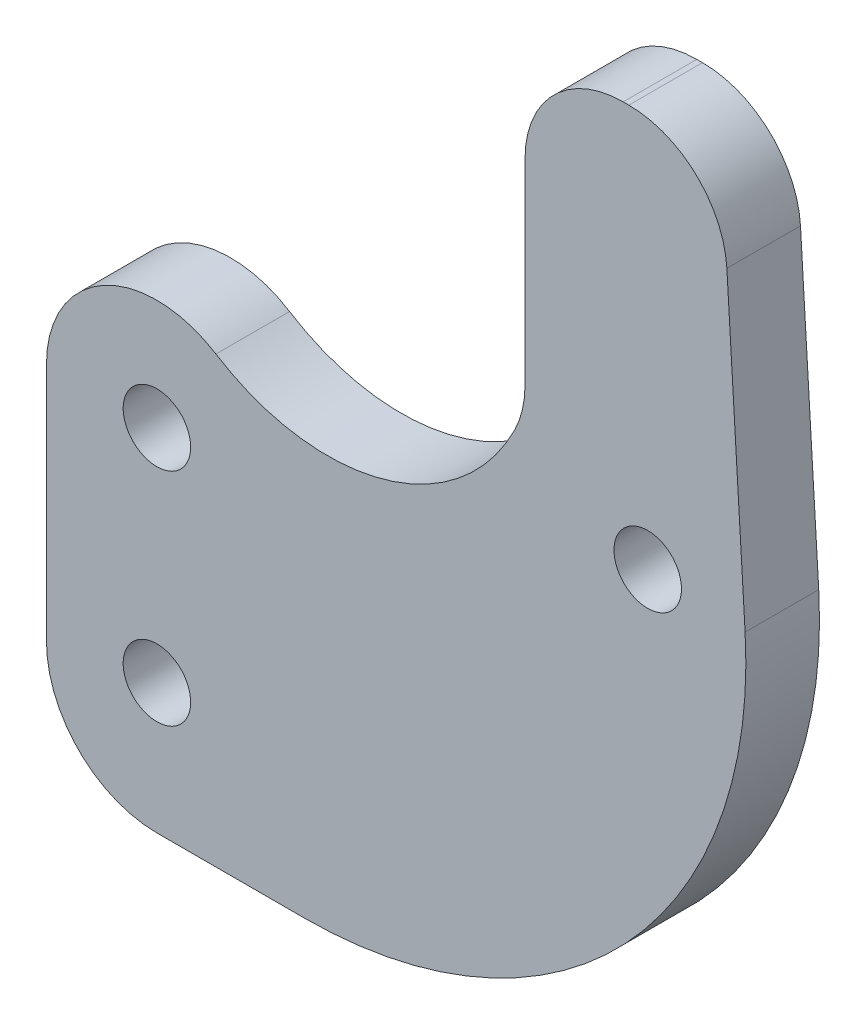
ISO-10303-21;
HEADER;
FILE_DESCRIPTION(('STEP AP214'),'2;1');
FILE_NAME('part.step','',(''),(''),'','','');
FILE_SCHEMA(('AUTOMOTIVE_DESIGN { 1 0 10303 214 1 1 1 1 }'));
ENDSEC;
DATA;
#1=APPLICATION_CONTEXT('core data for automotive mechanical design processes');
#2=APPLICATION_PROTOCOL_DEFINITION('international standard','automotive_design',2000,#1);
#3=PRODUCT_CONTEXT('',#1,'mechanical');
#4=PRODUCT('Part','Part','',(#3));
#5=PRODUCT_RELATED_PRODUCT_CATEGORY('part','',(#4));
#6=PRODUCT_DEFINITION_FORMATION('','',#4);
#7=PRODUCT_DEFINITION_CONTEXT('part definition',#1,'design');
#8=PRODUCT_DEFINITION('design','',#6,#7);
#9=PRODUCT_DEFINITION_SHAPE('','',#8);
#10=(LENGTH_UNIT() NAMED_UNIT(*) SI_UNIT(.MILLI.,.METRE.));
#11=(NAMED_UNIT(*) PLANE_ANGLE_UNIT() SI_UNIT($,.RADIAN.));
#12=(NAMED_UNIT(*) SI_UNIT($,.STERADIAN.) SOLID_ANGLE_UNIT());
#13=UNCERTAINTY_MEASURE_WITH_UNIT(LENGTH_MEASURE(1.E-05),#10,'distance_accuracy_value','');
#14=(GEOMETRIC_REPRESENTATION_CONTEXT(3) GLOBAL_UNCERTAINTY_ASSIGNED_CONTEXT((#13)) GLOBAL_UNIT_ASSIGNED_CONTEXT((#10,
#11,#12)) REPRESENTATION_CONTEXT('',''));
#15=CARTESIAN_POINT('',(0.,0.,0.));
#16=DIRECTION('',(0.,0.,1.));
#17=DIRECTION('',(1.,0.,0.));
#18=AXIS2_PLACEMENT_3D('',#15,#16,#17);
#19=CARTESIAN_POINT('',(0.,-0.8,3.));
#20=DIRECTION('',(0.,0.,1.));
#21=DIRECTION('',(1.,0.,0.));
#22=AXIS2_PLACEMENT_3D('',#19,#20,#21);
#23=PLANE('',#22);
#24=CARTESIAN_POINT('',(0.,9.,3.));
#25=DIRECTION('',(0.,0.,1.));
#26=DIRECTION('',(1.,0.,0.));
#27=AXIS2_PLACEMENT_3D('',#24,#25,#26);
#28=CIRCLE('',#27,1.375);
#29=CARTESIAN_POINT('',(1.375,9.,3.));
#30=VERTEX_POINT('',#29);
#31=EDGE_CURVE('E284',#30,#30,#28,.T.);
#32=ORIENTED_EDGE('',*,*,#31,.F.);
#33=EDGE_LOOP('',(#32));
#34=FACE_BOUND('',#33,.T.);
#35=DIRECTION('',(-1.,0.,0.));
#36=VECTOR('',#35,1.);
#37=CARTESIAN_POINT('',(15.,30.,3.));
#38=LINE('',#37,#36);
#39=CARTESIAN_POINT('',(19.2315015872004,30.,3.));
#40=VERTEX_POINT('',#39);
#41=CARTESIAN_POINT('',(19.,30.,3.));
#42=VERTEX_POINT('',#41);
#43=EDGE_CURVE('E188',#40,#42,#38,.T.);
#44=ORIENTED_EDGE('',*,*,#43,.T.);
#45=CARTESIAN_POINT('',(19.,26.,3.));
#46=DIRECTION('',(0.,0.,1.));
#47=DIRECTION('',(1.,0.,0.));
#48=AXIS2_PLACEMENT_3D('',#45,#46,#47);
#49=CIRCLE('',#48,4.);
#50=CARTESIAN_POINT('',(15.,26.,3.));
#51=VERTEX_POINT('',#50);
#52=EDGE_CURVE('E45',#42,#51,#49,.T.);
#53=ORIENTED_EDGE('',*,*,#52,.T.);
#54=DIRECTION('',(0.,-1.,0.));
#55=VECTOR('',#54,1.);
#56=CARTESIAN_POINT('',(15.,18.,3.));
#57=LINE('',#56,#55);
#58=CARTESIAN_POINT('',(15.,18.,3.));
#59=VERTEX_POINT('',#58);
#60=EDGE_CURVE('E186',#51,#59,#57,.T.);
#61=ORIENTED_EDGE('',*,*,#60,.T.);
#62=CARTESIAN_POINT('',(11.,18.,3.));
#63=DIRECTION('',(0.,0.,-1.));
#64=DIRECTION('',(-1.,0.,0.));
#65=AXIS2_PLACEMENT_3D('',#62,#63,#64);
#66=CIRCLE('',#65,4.);
#67=CARTESIAN_POINT('',(14.585878733306,16.2275797027725,3.));
#68=VERTEX_POINT('',#67);
#69=EDGE_CURVE('E197',#59,#68,#66,.T.);
#70=ORIENTED_EDGE('',*,*,#69,.T.);
#71=CARTESIAN_POINT('',(6.95369254243466,20.,3.));
#72=DIRECTION('',(0.,0.,-1.));
#73=DIRECTION('',(1.,0.,0.));
#74=AXIS2_PLACEMENT_3D('',#71,#72,#73);
#75=CIRCLE('',#74,8.51360211373897);
#76=CARTESIAN_POINT('',(2.40453151767413,12.8037124208478,3.));
#77=VERTEX_POINT('',#76);
#78=EDGE_CURVE('E264',#68,#77,#75,.T.);
#79=ORIENTED_EDGE('',*,*,#78,.T.);
#80=CARTESIAN_POINT('',(0.,9.,3.));
#81=DIRECTION('',(0.,0.,1.));
#82=DIRECTION('',(1.,0.,0.));
#83=AXIS2_PLACEMENT_3D('',#80,#81,#82);
#84=CIRCLE('',#83,4.5);
#85=CARTESIAN_POINT('',(-4.5,9.,3.));
#86=VERTEX_POINT('',#85);
#87=EDGE_CURVE('E267',#77,#86,#84,.T.);
#88=ORIENTED_EDGE('',*,*,#87,.T.);
#89=DIRECTION('',(0.,-1.,0.));
#90=VECTOR('',#89,1.);
#91=CARTESIAN_POINT('',(-4.5,-0.8,3.));
#92=LINE('',#91,#90);
#93=CARTESIAN_POINT('',(-4.5,-0.8,3.));
#94=VERTEX_POINT('',#93);
#95=EDGE_CURVE('E145',#86,#94,#92,.T.);
#96=ORIENTED_EDGE('',*,*,#95,.T.);
#97=CARTESIAN_POINT('',(0.,-0.8,3.));
#98=DIRECTION('',(0.,0.,1.));
#99=DIRECTION('',(1.,0.,0.));
#100=AXIS2_PLACEMENT_3D('',#97,#98,#99);
#101=CIRCLE('',#100,4.5);
#102=CARTESIAN_POINT('',(0.,-5.3,3.));
#103=VERTEX_POINT('',#102);
#104=EDGE_CURVE('E140',#94,#103,#101,.T.);
#105=ORIENTED_EDGE('',*,*,#104,.T.);
#106=DIRECTION('',(1.,0.,0.));
#107=VECTOR('',#106,1.);
#108=CARTESIAN_POINT('',(0.,-5.3,3.));
#109=LINE('',#108,#107);
#110=CARTESIAN_POINT('',(6.,-5.3,3.));
#111=VERTEX_POINT('',#110);
#112=EDGE_CURVE('E128',#103,#111,#109,.T.);
#113=ORIENTED_EDGE('',*,*,#112,.T.);
#114=CARTESIAN_POINT('',(6.,12.7,3.));
#115=DIRECTION('',(0.,0.,1.));
#116=DIRECTION('',(1.,0.,0.));
#117=AXIS2_PLACEMENT_3D('',#114,#115,#116);
#118=CIRCLE('',#117,18.);
#119=CARTESIAN_POINT('',(23.96805883273,13.7718497019416,3.));
#120=VERTEX_POINT('',#119);
#121=EDGE_CURVE('E139',#111,#120,#118,.T.);
#122=ORIENTED_EDGE('',*,*,#121,.T.);
#123=DIRECTION('',(-0.0595472056634214,0.998225490707224,0.));
#124=VECTOR('',#123,1.);
#125=CARTESIAN_POINT('',(23.96805883273,13.7718497019416,3.));
#126=LINE('',#125,#124);
#127=CARTESIAN_POINT('',(23.2244035500293,26.2381888226537,3.));
#128=VERTEX_POINT('',#127);
#129=EDGE_CURVE('E250',#120,#128,#126,.T.);
#130=ORIENTED_EDGE('',*,*,#129,.T.);
#131=CARTESIAN_POINT('',(19.2315015872004,26.,3.));
#132=DIRECTION('',(0.,0.,1.));
#133=DIRECTION('',(1.,0.,0.));
#134=AXIS2_PLACEMENT_3D('',#131,#132,#133);
#135=CIRCLE('',#134,4.);
#136=EDGE_CURVE('E180',#128,#40,#135,.T.);
#137=ORIENTED_EDGE('',*,*,#136,.T.);
#138=EDGE_LOOP('',(#44,#53,#61,#70,#79,#88,#96,#105,#113,#122,#130,#137));
#139=FACE_BOUND('',#138,.T.);
#140=CARTESIAN_POINT('',(0.,0.,3.));
#141=DIRECTION('',(0.,0.,1.));
#142=DIRECTION('',(1.,0.,0.));
#143=AXIS2_PLACEMENT_3D('',#140,#141,#142);
#144=CIRCLE('',#143,1.375);
#145=CARTESIAN_POINT('',(1.375,0.,3.));
#146=VERTEX_POINT('',#145);
#147=EDGE_CURVE('E275',#146,#146,#144,.T.);
#148=ORIENTED_EDGE('',*,*,#147,.F.);
#149=EDGE_LOOP('',(#148));
#150=FACE_BOUND('',#149,.T.);
#151=CARTESIAN_POINT('',(20.,14.,3.));
#152=DIRECTION('',(0.,0.,1.));
#153=DIRECTION('',(1.,0.,0.));
#154=AXIS2_PLACEMENT_3D('',#151,#152,#153);
#155=CIRCLE('',#154,1.375);
#156=CARTESIAN_POINT('',(21.375,14.,3.));
#157=VERTEX_POINT('',#156);
#158=EDGE_CURVE('E292',#157,#157,#155,.T.);
#159=ORIENTED_EDGE('',*,*,#158,.F.);
#160=EDGE_LOOP('',(#159));
#161=FACE_BOUND('',#160,.T.);
#162=ADVANCED_FACE('F36',(#34,#139,#150,#161),#23,.T.);
#163=CARTESIAN_POINT('',(0.,-0.8,0.));
#164=DIRECTION('',(0.,0.,1.));
#165=DIRECTION('',(1.,0.,0.));
#166=AXIS2_PLACEMENT_3D('',#163,#164,#165);
#167=PLANE('',#166);
#168=DIRECTION('',(0.,-1.,0.));
#169=VECTOR('',#168,1.);
#170=CARTESIAN_POINT('',(15.,18.,0.));
#171=LINE('',#170,#169);
#172=CARTESIAN_POINT('',(15.,26.,0.));
#173=VERTEX_POINT('',#172);
#174=CARTESIAN_POINT('',(15.,18.,0.));
#175=VERTEX_POINT('',#174);
#176=EDGE_CURVE('E206',#173,#175,#171,.T.);
#177=ORIENTED_EDGE('',*,*,#176,.F.);
#178=CARTESIAN_POINT('',(19.,26.,0.));
#179=DIRECTION('',(0.,0.,1.));
#180=DIRECTION('',(1.,0.,0.));
#181=AXIS2_PLACEMENT_3D('',#178,#179,#180);
#182=CIRCLE('',#181,4.);
#183=CARTESIAN_POINT('',(19.,30.,0.));
#184=VERTEX_POINT('',#183);
#185=EDGE_CURVE('E171',#173,#184,#182,.F.);
#186=ORIENTED_EDGE('',*,*,#185,.T.);
#187=DIRECTION('',(-1.,0.,0.));
#188=VECTOR('',#187,1.);
#189=CARTESIAN_POINT('',(15.,30.,0.));
#190=LINE('',#189,#188);
#191=CARTESIAN_POINT('',(19.2315015872004,30.,0.));
#192=VERTEX_POINT('',#191);
#193=EDGE_CURVE('E204',#192,#184,#190,.T.);
#194=ORIENTED_EDGE('',*,*,#193,.F.);
#195=CARTESIAN_POINT('',(19.2315015872004,26.,0.));
#196=DIRECTION('',(0.,0.,1.));
#197=DIRECTION('',(1.,0.,0.));
#198=AXIS2_PLACEMENT_3D('',#195,#196,#197);
#199=CIRCLE('',#198,4.);
#200=CARTESIAN_POINT('',(23.2244035500293,26.2381888226537,0.));
#201=VERTEX_POINT('',#200);
#202=EDGE_CURVE('E162',#192,#201,#199,.F.);
#203=ORIENTED_EDGE('',*,*,#202,.T.);
#204=DIRECTION('',(-0.0595472056634214,0.998225490707224,0.));
#205=VECTOR('',#204,1.);
#206=CARTESIAN_POINT('',(23.96805883273,13.7718497019416,0.));
#207=LINE('',#206,#205);
#208=CARTESIAN_POINT('',(23.96805883273,13.7718497019416,0.));
#209=VERTEX_POINT('',#208);
#210=EDGE_CURVE('E210',#209,#201,#207,.T.);
#211=ORIENTED_EDGE('',*,*,#210,.F.);
#212=CARTESIAN_POINT('',(6.,12.7,0.));
#213=DIRECTION('',(0.,0.,1.));
#214=DIRECTION('',(1.,0.,0.));
#215=AXIS2_PLACEMENT_3D('',#212,#213,#214);
#216=CIRCLE('',#215,18.);
#217=CARTESIAN_POINT('',(6.,-5.3,0.));
#218=VERTEX_POINT('',#217);
#219=EDGE_CURVE('E216',#218,#209,#216,.T.);
#220=ORIENTED_EDGE('',*,*,#219,.F.);
#221=DIRECTION('',(1.,0.,0.));
#222=VECTOR('',#221,1.);
#223=CARTESIAN_POINT('',(0.,-5.3,0.));
#224=LINE('',#223,#222);
#225=CARTESIAN_POINT('',(0.,-5.3,0.));
#226=VERTEX_POINT('',#225);
#227=EDGE_CURVE('E274',#226,#218,#224,.T.);
#228=ORIENTED_EDGE('',*,*,#227,.F.);
#229=CARTESIAN_POINT('',(0.,-0.8,0.));
#230=DIRECTION('',(0.,0.,1.));
#231=DIRECTION('',(1.,0.,0.));
#232=AXIS2_PLACEMENT_3D('',#229,#230,#231);
#233=CIRCLE('',#232,4.5);
#234=CARTESIAN_POINT('',(-4.5,-0.8,0.));
#235=VERTEX_POINT('',#234);
#236=EDGE_CURVE('E154',#235,#226,#233,.T.);
#237=ORIENTED_EDGE('',*,*,#236,.F.);
#238=DIRECTION('',(0.,-1.,0.));
#239=VECTOR('',#238,1.);
#240=CARTESIAN_POINT('',(-4.5,-0.8,0.));
#241=LINE('',#240,#239);
#242=CARTESIAN_POINT('',(-4.5,9.,0.));
#243=VERTEX_POINT('',#242);
#244=EDGE_CURVE('E150',#243,#235,#241,.T.);
#245=ORIENTED_EDGE('',*,*,#244,.F.);
#246=CARTESIAN_POINT('',(0.,9.,0.));
#247=DIRECTION('',(0.,0.,1.));
#248=DIRECTION('',(1.,0.,0.));
#249=AXIS2_PLACEMENT_3D('',#246,#247,#248);
#250=CIRCLE('',#249,4.5);
#251=CARTESIAN_POINT('',(2.40453151767413,12.8037124208478,0.));
#252=VERTEX_POINT('',#251);
#253=EDGE_CURVE('E225',#252,#243,#250,.T.);
#254=ORIENTED_EDGE('',*,*,#253,.F.);
#255=CARTESIAN_POINT('',(6.95369254243466,20.,0.));
#256=DIRECTION('',(0.,0.,-1.));
#257=DIRECTION('',(1.,0.,0.));
#258=AXIS2_PLACEMENT_3D('',#255,#256,#257);
#259=CIRCLE('',#258,8.51360211373897);
#260=CARTESIAN_POINT('',(14.585878733306,16.2275797027725,0.));
#261=VERTEX_POINT('',#260);
#262=EDGE_CURVE('E222',#261,#252,#259,.T.);
#263=ORIENTED_EDGE('',*,*,#262,.F.);
#264=CARTESIAN_POINT('',(11.,18.,0.));
#265=DIRECTION('',(0.,0.,-1.));
#266=DIRECTION('',(-1.,0.,0.));
#267=AXIS2_PLACEMENT_3D('',#264,#265,#266);
#268=CIRCLE('',#267,4.);
#269=EDGE_CURVE('E213',#175,#261,#268,.T.);
#270=ORIENTED_EDGE('',*,*,#269,.F.);
#271=EDGE_LOOP('',(#177,#186,#194,#203,#211,#220,#228,#237,#245,#254,#263,#270));
#272=FACE_BOUND('',#271,.T.);
#273=CARTESIAN_POINT('',(0.,0.,0.));
#274=DIRECTION('',(0.,0.,1.));
#275=DIRECTION('',(1.,0.,0.));
#276=AXIS2_PLACEMENT_3D('',#273,#274,#275);
#277=CIRCLE('',#276,1.375);
#278=CARTESIAN_POINT('',(1.375,0.,0.));
#279=VERTEX_POINT('',#278);
#280=EDGE_CURVE('E281',#279,#279,#277,.T.);
#281=ORIENTED_EDGE('',*,*,#280,.T.);
#282=EDGE_LOOP('',(#281));
#283=FACE_BOUND('',#282,.T.);
#284=CARTESIAN_POINT('',(0.,9.,0.));
#285=DIRECTION('',(0.,0.,1.));
#286=DIRECTION('',(1.,0.,0.));
#287=AXIS2_PLACEMENT_3D('',#284,#285,#286);
#288=CIRCLE('',#287,1.375);
#289=CARTESIAN_POINT('',(1.375,9.,0.));
#290=VERTEX_POINT('',#289);
#291=EDGE_CURVE('E288',#290,#290,#288,.T.);
#292=ORIENTED_EDGE('',*,*,#291,.T.);
#293=EDGE_LOOP('',(#292));
#294=FACE_BOUND('',#293,.T.);
#295=CARTESIAN_POINT('',(20.,14.,0.));
#296=DIRECTION('',(0.,0.,1.));
#297=DIRECTION('',(1.,0.,0.));
#298=AXIS2_PLACEMENT_3D('',#295,#296,#297);
#299=CIRCLE('',#298,1.375);
#300=CARTESIAN_POINT('',(21.375,14.,0.));
#301=VERTEX_POINT('',#300);
#302=EDGE_CURVE('E296',#301,#301,#299,.T.);
#303=ORIENTED_EDGE('',*,*,#302,.T.);
#304=EDGE_LOOP('',(#303));
#305=FACE_BOUND('',#304,.T.);
#306=ADVANCED_FACE('F202',(#272,#283,#294,#305),#167,.F.);
#307=CARTESIAN_POINT('',(0.,-0.8,3.));
#308=DIRECTION('',(0.,0.,-1.));
#309=DIRECTION('',(-1.,0.,0.));
#310=AXIS2_PLACEMENT_3D('',#307,#308,#309);
#311=CYLINDRICAL_SURFACE('',#310,4.5);
#312=ORIENTED_EDGE('',*,*,#236,.T.);
#313=DIRECTION('',(0.,0.,-1.));
#314=VECTOR('',#313,1.);
#315=CARTESIAN_POINT('',(0.,-5.3,3.));
#316=LINE('',#315,#314);
#317=EDGE_CURVE('E132',#103,#226,#316,.T.);
#318=ORIENTED_EDGE('',*,*,#317,.F.);
#319=ORIENTED_EDGE('',*,*,#104,.F.);
#320=DIRECTION('',(0.,0.,-1.));
#321=VECTOR('',#320,1.);
#322=CARTESIAN_POINT('',(-4.5,-0.8,3.));
#323=LINE('',#322,#321);
#324=EDGE_CURVE('E230',#94,#235,#323,.T.);
#325=ORIENTED_EDGE('',*,*,#324,.T.);
#326=EDGE_LOOP('',(#312,#318,#319,#325));
#327=FACE_BOUND('',#326,.T.);
#328=ADVANCED_FACE('F152',(#327),#311,.T.);
#329=CARTESIAN_POINT('',(0.,-5.3,3.));
#330=DIRECTION('',(0.,1.,0.));
#331=DIRECTION('',(-1.,0.,0.));
#332=AXIS2_PLACEMENT_3D('',#329,#330,#331);
#333=PLANE('',#332);
#334=ORIENTED_EDGE('',*,*,#227,.T.);
#335=DIRECTION('',(0.,0.,-1.));
#336=VECTOR('',#335,1.);
#337=CARTESIAN_POINT('',(6.,-5.3,3.));
#338=LINE('',#337,#336);
#339=EDGE_CURVE('E135',#111,#218,#338,.T.);
#340=ORIENTED_EDGE('',*,*,#339,.F.);
#341=ORIENTED_EDGE('',*,*,#112,.F.);
#342=ORIENTED_EDGE('',*,*,#317,.T.);
#343=EDGE_LOOP('',(#334,#340,#341,#342));
#344=FACE_BOUND('',#343,.T.);
#345=ADVANCED_FACE('F130',(#344),#333,.F.);
#346=CARTESIAN_POINT('',(6.,12.7,3.));
#347=DIRECTION('',(0.,0.,-1.));
#348=DIRECTION('',(-1.,0.,0.));
#349=AXIS2_PLACEMENT_3D('',#346,#347,#348);
#350=CYLINDRICAL_SURFACE('',#349,18.);
#351=ORIENTED_EDGE('',*,*,#219,.T.);
#352=DIRECTION('',(0.,0.,-1.));
#353=VECTOR('',#352,1.);
#354=CARTESIAN_POINT('',(23.96805883273,13.7718497019416,3.));
#355=LINE('',#354,#353);
#356=EDGE_CURVE('E165',#120,#209,#355,.T.);
#357=ORIENTED_EDGE('',*,*,#356,.F.);
#358=ORIENTED_EDGE('',*,*,#121,.F.);
#359=ORIENTED_EDGE('',*,*,#339,.T.);
#360=EDGE_LOOP('',(#351,#357,#358,#359));
#361=FACE_BOUND('',#360,.T.);
#362=ADVANCED_FACE('F278',(#361),#350,.T.);
#363=CARTESIAN_POINT('',(23.96805883273,13.7718497019416,3.));
#364=DIRECTION('',(-0.998225490707224,-0.0595472056634214,0.));
#365=DIRECTION('',(0.0595472056634214,-0.998225490707224,0.));
#366=AXIS2_PLACEMENT_3D('',#363,#364,#365);
#367=PLANE('',#366);
#368=ORIENTED_EDGE('',*,*,#210,.T.);
#369=DIRECTION('',(0.,0.,-1.));
#370=VECTOR('',#369,1.);
#371=CARTESIAN_POINT('',(23.2244035500293,26.2381888226537,3.));
#372=LINE('',#371,#370);
#373=EDGE_CURVE('E11',#201,#128,#372,.F.);
#374=ORIENTED_EDGE('',*,*,#373,.T.);
#375=ORIENTED_EDGE('',*,*,#129,.F.);
#376=ORIENTED_EDGE('',*,*,#356,.T.);
#377=EDGE_LOOP('',(#368,#374,#375,#376));
#378=FACE_BOUND('',#377,.T.);
#379=ADVANCED_FACE('F249',(#378),#367,.F.);
#380=CARTESIAN_POINT('',(15.,30.,3.));
#381=DIRECTION('',(0.,-1.,0.));
#382=DIRECTION('',(0.,0.,-1.));
#383=AXIS2_PLACEMENT_3D('',#380,#381,#382);
#384=PLANE('',#383);
#385=ORIENTED_EDGE('',*,*,#193,.T.);
#386=DIRECTION('',(0.,0.,-1.));
#387=VECTOR('',#386,1.);
#388=CARTESIAN_POINT('',(19.,30.,3.));
#389=LINE('',#388,#387);
#390=EDGE_CURVE('E58',#184,#42,#389,.F.);
#391=ORIENTED_EDGE('',*,*,#390,.T.);
#392=ORIENTED_EDGE('',*,*,#43,.F.);
#393=DIRECTION('',(0.,0.,-1.));
#394=VECTOR('',#393,1.);
#395=CARTESIAN_POINT('',(19.2315015872004,30.,3.));
#396=LINE('',#395,#394);
#397=EDGE_CURVE('E174',#40,#192,#396,.T.);
#398=ORIENTED_EDGE('',*,*,#397,.T.);
#399=EDGE_LOOP('',(#385,#391,#392,#398));
#400=FACE_BOUND('',#399,.T.);
#401=ADVANCED_FACE('F207',(#400),#384,.F.);
#402=CARTESIAN_POINT('',(15.,18.,3.));
#403=DIRECTION('',(1.,0.,0.));
#404=DIRECTION('',(0.,0.,-1.));
#405=AXIS2_PLACEMENT_3D('',#402,#403,#404);
#406=PLANE('',#405);
#407=ORIENTED_EDGE('',*,*,#60,.F.);
#408=DIRECTION('',(0.,0.,-1.));
#409=VECTOR('',#408,1.);
#410=CARTESIAN_POINT('',(15.,26.,3.));
#411=LINE('',#410,#409);
#412=EDGE_CURVE('E156',#51,#173,#411,.T.);
#413=ORIENTED_EDGE('',*,*,#412,.T.);
#414=ORIENTED_EDGE('',*,*,#176,.T.);
#415=DIRECTION('',(0.,0.,-1.));
#416=VECTOR('',#415,1.);
#417=CARTESIAN_POINT('',(15.,18.,3.));
#418=LINE('',#417,#416);
#419=EDGE_CURVE('E195',#59,#175,#418,.T.);
#420=ORIENTED_EDGE('',*,*,#419,.F.);
#421=EDGE_LOOP('',(#407,#413,#414,#420));
#422=FACE_BOUND('',#421,.T.);
#423=ADVANCED_FACE('F192',(#422),#406,.F.);
#424=CARTESIAN_POINT('',(11.,18.,3.));
#425=DIRECTION('',(0.,0.,-1.));
#426=DIRECTION('',(-1.,0.,0.));
#427=AXIS2_PLACEMENT_3D('',#424,#425,#426);
#428=CYLINDRICAL_SURFACE('',#427,4.);
#429=ORIENTED_EDGE('',*,*,#269,.T.);
#430=DIRECTION('',(0.,0.,-1.));
#431=VECTOR('',#430,1.);
#432=CARTESIAN_POINT('',(14.585878733306,16.2275797027725,3.));
#433=LINE('',#432,#431);
#434=EDGE_CURVE('E240',#68,#261,#433,.T.);
#435=ORIENTED_EDGE('',*,*,#434,.F.);
#436=ORIENTED_EDGE('',*,*,#69,.F.);
#437=ORIENTED_EDGE('',*,*,#419,.T.);
#438=EDGE_LOOP('',(#429,#435,#436,#437));
#439=FACE_BOUND('',#438,.T.);
#440=ADVANCED_FACE('F329',(#439),#428,.F.);
#441=CARTESIAN_POINT('',(6.95369254243466,20.,3.));
#442=DIRECTION('',(0.,0.,-1.));
#443=DIRECTION('',(-1.,0.,0.));
#444=AXIS2_PLACEMENT_3D('',#441,#442,#443);
#445=CYLINDRICAL_SURFACE('',#444,8.51360211373897);
#446=ORIENTED_EDGE('',*,*,#262,.T.);
#447=DIRECTION('',(0.,0.,-1.));
#448=VECTOR('',#447,1.);
#449=CARTESIAN_POINT('',(2.40453151767413,12.8037124208478,3.));
#450=LINE('',#449,#448);
#451=EDGE_CURVE('E236',#77,#252,#450,.T.);
#452=ORIENTED_EDGE('',*,*,#451,.F.);
#453=ORIENTED_EDGE('',*,*,#78,.F.);
#454=ORIENTED_EDGE('',*,*,#434,.T.);
#455=EDGE_LOOP('',(#446,#452,#453,#454));
#456=FACE_BOUND('',#455,.T.);
#457=ADVANCED_FACE('F325',(#456),#445,.F.);
#458=CARTESIAN_POINT('',(0.,9.,3.));
#459=DIRECTION('',(0.,0.,-1.));
#460=DIRECTION('',(-1.,0.,0.));
#461=AXIS2_PLACEMENT_3D('',#458,#459,#460);
#462=CYLINDRICAL_SURFACE('',#461,4.5);
#463=ORIENTED_EDGE('',*,*,#253,.T.);
#464=DIRECTION('',(0.,0.,-1.));
#465=VECTOR('',#464,1.);
#466=CARTESIAN_POINT('',(-4.5,9.,3.));
#467=LINE('',#466,#465);
#468=EDGE_CURVE('E232',#86,#243,#467,.T.);
#469=ORIENTED_EDGE('',*,*,#468,.F.);
#470=ORIENTED_EDGE('',*,*,#87,.F.);
#471=ORIENTED_EDGE('',*,*,#451,.T.);
#472=EDGE_LOOP('',(#463,#469,#470,#471));
#473=FACE_BOUND('',#472,.T.);
#474=ADVANCED_FACE('F321',(#473),#462,.T.);
#475=CARTESIAN_POINT('',(-4.5,-0.8,3.));
#476=DIRECTION('',(1.,0.,0.));
#477=DIRECTION('',(0.,0.,-1.));
#478=AXIS2_PLACEMENT_3D('',#475,#476,#477);
#479=PLANE('',#478);
#480=ORIENTED_EDGE('',*,*,#244,.T.);
#481=ORIENTED_EDGE('',*,*,#324,.F.);
#482=ORIENTED_EDGE('',*,*,#95,.F.);
#483=ORIENTED_EDGE('',*,*,#468,.T.);
#484=EDGE_LOOP('',(#480,#481,#482,#483));
#485=FACE_BOUND('',#484,.T.);
#486=ADVANCED_FACE('F318',(#485),#479,.F.);
#487=CARTESIAN_POINT('',(0.,0.,3.));
#488=DIRECTION('',(0.,0.,-1.));
#489=DIRECTION('',(-1.,0.,0.));
#490=AXIS2_PLACEMENT_3D('',#487,#488,#489);
#491=CYLINDRICAL_SURFACE('',#490,1.375);
#492=ORIENTED_EDGE('',*,*,#147,.T.);
#493=EDGE_LOOP('',(#492));
#494=FACE_BOUND('',#493,.T.);
#495=ORIENTED_EDGE('',*,*,#280,.F.);
#496=EDGE_LOOP('',(#495));
#497=FACE_BOUND('',#496,.T.);
#498=ADVANCED_FACE('F315',(#494,#497),#491,.F.);
#499=CARTESIAN_POINT('',(0.,9.,3.));
#500=DIRECTION('',(0.,0.,-1.));
#501=DIRECTION('',(-1.,0.,0.));
#502=AXIS2_PLACEMENT_3D('',#499,#500,#501);
#503=CYLINDRICAL_SURFACE('',#502,1.375);
#504=ORIENTED_EDGE('',*,*,#31,.T.);
#505=EDGE_LOOP('',(#504));
#506=FACE_BOUND('',#505,.T.);
#507=ORIENTED_EDGE('',*,*,#291,.F.);
#508=EDGE_LOOP('',(#507));
#509=FACE_BOUND('',#508,.T.);
#510=ADVANCED_FACE('F350',(#506,#509),#503,.F.);
#511=CARTESIAN_POINT('',(20.,14.,3.));
#512=DIRECTION('',(0.,0.,-1.));
#513=DIRECTION('',(-1.,0.,0.));
#514=AXIS2_PLACEMENT_3D('',#511,#512,#513);
#515=CYLINDRICAL_SURFACE('',#514,1.375);
#516=ORIENTED_EDGE('',*,*,#158,.T.);
#517=EDGE_LOOP('',(#516));
#518=FACE_BOUND('',#517,.T.);
#519=ORIENTED_EDGE('',*,*,#302,.F.);
#520=EDGE_LOOP('',(#519));
#521=FACE_BOUND('',#520,.T.);
#522=ADVANCED_FACE('F303',(#518,#521),#515,.F.);
#523=CARTESIAN_POINT('',(19.,26.,3.));
#524=DIRECTION('',(0.,0.,-1.));
#525=DIRECTION('',(-1.,0.,0.));
#526=AXIS2_PLACEMENT_3D('',#523,#524,#525);
#527=CYLINDRICAL_SURFACE('',#526,4.);
#528=ORIENTED_EDGE('',*,*,#52,.F.);
#529=ORIENTED_EDGE('',*,*,#390,.F.);
#530=ORIENTED_EDGE('',*,*,#185,.F.);
#531=ORIENTED_EDGE('',*,*,#412,.F.);
#532=EDGE_LOOP('',(#528,#529,#530,#531));
#533=FACE_BOUND('',#532,.T.);
#534=ADVANCED_FACE('F199',(#533),#527,.T.);
#535=CARTESIAN_POINT('',(19.2315015872004,26.,3.));
#536=DIRECTION('',(0.,0.,-1.));
#537=DIRECTION('',(-1.,0.,0.));
#538=AXIS2_PLACEMENT_3D('',#535,#536,#537);
#539=CYLINDRICAL_SURFACE('',#538,4.);
#540=ORIENTED_EDGE('',*,*,#136,.F.);
#541=ORIENTED_EDGE('',*,*,#373,.F.);
#542=ORIENTED_EDGE('',*,*,#202,.F.);
#543=ORIENTED_EDGE('',*,*,#397,.F.);
#544=EDGE_LOOP('',(#540,#541,#542,#543));
#545=FACE_BOUND('',#544,.T.);
#546=ADVANCED_FACE('F38',(#545),#539,.T.);
#547=CLOSED_SHELL('',(#162,#306,#328,#345,#362,#379,#401,#423,#440,#457,#474,#486,#498,#510,
#522,#534,#546));
#548=MANIFOLD_SOLID_BREP('B2',#547);
#549=ADVANCED_BREP_SHAPE_REPRESENTATION('',(#18,#548),#14);
#550=SHAPE_DEFINITION_REPRESENTATION(#9,#549);
ENDSEC;
END-ISO-10303-21;
